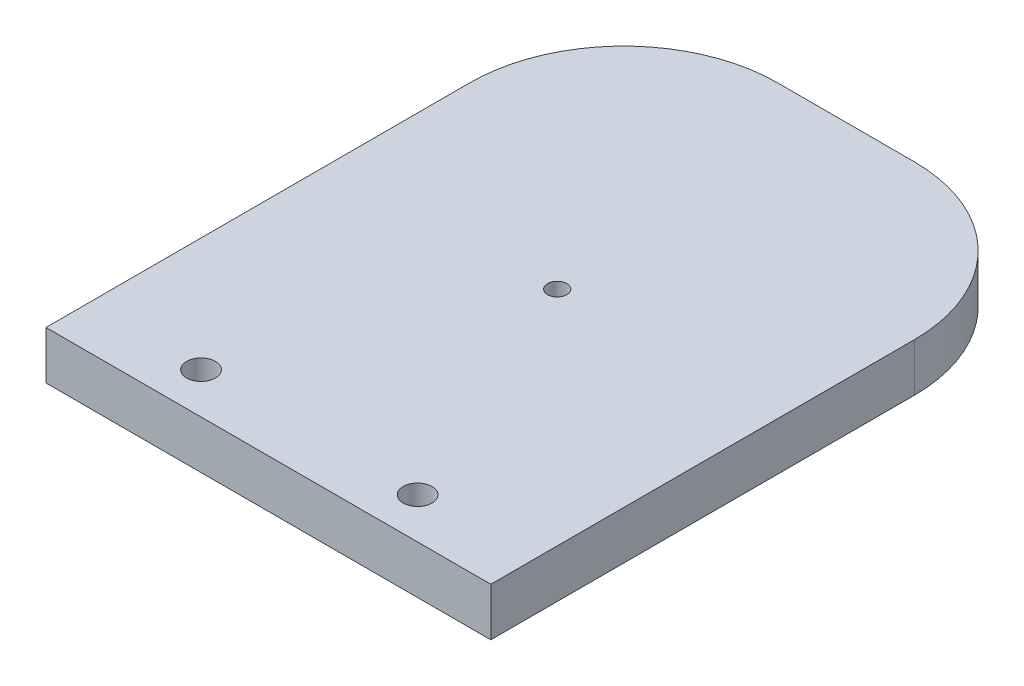
ISO-10303-21;
HEADER;
FILE_DESCRIPTION(('STEP AP214'),'2;1');
FILE_NAME('part.step','',(''),(''),'','','');
FILE_SCHEMA(('AUTOMOTIVE_DESIGN { 1 0 10303 214 1 1 1 1 }'));
ENDSEC;
DATA;
#1=APPLICATION_CONTEXT('core data for automotive mechanical design processes');
#2=APPLICATION_PROTOCOL_DEFINITION('international standard','automotive_design',2000,#1);
#3=PRODUCT_CONTEXT('',#1,'mechanical');
#4=PRODUCT('Part','Part','',(#3));
#5=PRODUCT_RELATED_PRODUCT_CATEGORY('part','',(#4));
#6=PRODUCT_DEFINITION_FORMATION('','',#4);
#7=PRODUCT_DEFINITION_CONTEXT('part definition',#1,'design');
#8=PRODUCT_DEFINITION('design','',#6,#7);
#9=PRODUCT_DEFINITION_SHAPE('','',#8);
#10=(LENGTH_UNIT() NAMED_UNIT(*) SI_UNIT(.MILLI.,.METRE.));
#11=(NAMED_UNIT(*) PLANE_ANGLE_UNIT() SI_UNIT($,.RADIAN.));
#12=(NAMED_UNIT(*) SI_UNIT($,.STERADIAN.) SOLID_ANGLE_UNIT());
#13=UNCERTAINTY_MEASURE_WITH_UNIT(LENGTH_MEASURE(1.E-05),#10,'distance_accuracy_value','');
#14=(GEOMETRIC_REPRESENTATION_CONTEXT(3) GLOBAL_UNCERTAINTY_ASSIGNED_CONTEXT((#13)) GLOBAL_UNIT_ASSIGNED_CONTEXT((#10,
#11,#12)) REPRESENTATION_CONTEXT('',''));
#15=CARTESIAN_POINT('',(0.,0.,0.));
#16=DIRECTION('',(0.,0.,1.));
#17=DIRECTION('',(1.,0.,0.));
#18=AXIS2_PLACEMENT_3D('',#15,#16,#17);
#19=CARTESIAN_POINT('',(0.,6.35,0.));
#20=DIRECTION('',(0.,1.,0.));
#21=DIRECTION('',(0.,0.,1.));
#22=AXIS2_PLACEMENT_3D('',#19,#20,#21);
#23=PLANE('',#22);
#24=CARTESIAN_POINT('',(15.0495,6.35,-5.39750000000001));
#25=DIRECTION('',(0.,1.,0.));
#26=DIRECTION('',(0.,0.,1.));
#27=AXIS2_PLACEMENT_3D('',#24,#25,#26);
#28=CIRCLE('',#27,1.89865);
#29=CARTESIAN_POINT('',(15.0495,6.35,-3.49885000000001));
#30=VERTEX_POINT('',#29);
#31=EDGE_CURVE('E200',#30,#30,#28,.T.);
#32=ORIENTED_EDGE('',*,*,#31,.F.);
#33=EDGE_LOOP('',(#32));
#34=FACE_BOUND('',#33,.T.);
#35=CARTESIAN_POINT('',(43.6245,6.35,-5.39750000000002));
#36=DIRECTION('',(0.,1.,0.));
#37=DIRECTION('',(0.,0.,1.));
#38=AXIS2_PLACEMENT_3D('',#35,#36,#37);
#39=CIRCLE('',#38,1.89865);
#40=CARTESIAN_POINT('',(43.6245,6.35,-3.49885000000002));
#41=VERTEX_POINT('',#40);
#42=EDGE_CURVE('E202',#41,#41,#39,.T.);
#43=ORIENTED_EDGE('',*,*,#42,.F.);
#44=EDGE_LOOP('',(#43));
#45=FACE_BOUND('',#44,.T.);
#46=DIRECTION('',(1.,0.,0.));
#47=VECTOR('',#46,1.);
#48=CARTESIAN_POINT('',(0.,6.35,0.));
#49=LINE('',#48,#47);
#50=CARTESIAN_POINT('',(0.,6.35,0.));
#51=VERTEX_POINT('',#50);
#52=CARTESIAN_POINT('',(58.674,6.35,0.));
#53=VERTEX_POINT('',#52);
#54=EDGE_CURVE('E87',#51,#53,#49,.T.);
#55=ORIENTED_EDGE('',*,*,#54,.T.);
#56=DIRECTION('',(0.,0.,-1.));
#57=VECTOR('',#56,1.);
#58=CARTESIAN_POINT('',(58.674,6.35,0.));
#59=LINE('',#58,#57);
#60=CARTESIAN_POINT('',(58.6739999999998,6.35,-55.8800000000001));
#61=VERTEX_POINT('',#60);
#62=EDGE_CURVE('E90',#53,#61,#59,.T.);
#63=ORIENTED_EDGE('',*,*,#62,.T.);
#64=CARTESIAN_POINT('',(38.3539999999998,6.35,-55.88));
#65=DIRECTION('',(0.,1.,0.));
#66=DIRECTION('',(0.,0.,1.));
#67=AXIS2_PLACEMENT_3D('',#64,#65,#66);
#68=CIRCLE('',#67,20.32);
#69=CARTESIAN_POINT('',(38.3539999999998,6.35,-76.2));
#70=VERTEX_POINT('',#69);
#71=EDGE_CURVE('E41',#61,#70,#68,.T.);
#72=ORIENTED_EDGE('',*,*,#71,.T.);
#73=DIRECTION('',(-1.,0.,0.));
#74=VECTOR('',#73,1.);
#75=CARTESIAN_POINT('',(-2.84714495238852E-13,6.35,-76.2));
#76=LINE('',#75,#74);
#77=CARTESIAN_POINT('',(20.3199999999998,6.35,-76.2));
#78=VERTEX_POINT('',#77);
#79=EDGE_CURVE('E106',#70,#78,#76,.T.);
#80=ORIENTED_EDGE('',*,*,#79,.T.);
#81=CARTESIAN_POINT('',(20.3199999999998,6.35,-55.88));
#82=DIRECTION('',(0.,1.,0.));
#83=DIRECTION('',(0.,0.,1.));
#84=AXIS2_PLACEMENT_3D('',#81,#82,#83);
#85=CIRCLE('',#84,20.32);
#86=CARTESIAN_POINT('',(-2.08790629841825E-13,6.35,-55.8799999999999));
#87=VERTEX_POINT('',#86);
#88=EDGE_CURVE('E48',#78,#87,#85,.T.);
#89=ORIENTED_EDGE('',*,*,#88,.T.);
#90=DIRECTION('',(0.,0.,1.));
#91=VECTOR('',#90,1.);
#92=CARTESIAN_POINT('',(0.,6.35,0.));
#93=LINE('',#92,#91);
#94=EDGE_CURVE('E92',#87,#51,#93,.T.);
#95=ORIENTED_EDGE('',*,*,#94,.T.);
#96=EDGE_LOOP('',(#55,#63,#72,#80,#89,#95));
#97=FACE_BOUND('',#96,.T.);
#98=CARTESIAN_POINT('',(29.337,6.35,-38.1));
#99=DIRECTION('',(0.,1.,0.));
#100=DIRECTION('',(0.,0.,1.));
#101=AXIS2_PLACEMENT_3D('',#98,#99,#100);
#102=CIRCLE('',#101,1.26999999999999);
#103=CARTESIAN_POINT('',(29.337,6.35,-36.83));
#104=VERTEX_POINT('',#103);
#105=EDGE_CURVE('E113',#104,#104,#102,.T.);
#106=ORIENTED_EDGE('',*,*,#105,.F.);
#107=EDGE_LOOP('',(#106));
#108=FACE_BOUND('',#107,.T.);
#109=ADVANCED_FACE('F33',(#34,#45,#97,#108),#23,.T.);
#110=CARTESIAN_POINT('',(0.,0.,0.));
#111=DIRECTION('',(0.,1.,0.));
#112=DIRECTION('',(0.,0.,1.));
#113=AXIS2_PLACEMENT_3D('',#110,#111,#112);
#114=PLANE('',#113);
#115=CARTESIAN_POINT('',(15.0495,0.,-5.39750000000001));
#116=DIRECTION('',(0.,1.,0.));
#117=DIRECTION('',(0.,0.,1.));
#118=AXIS2_PLACEMENT_3D('',#115,#116,#117);
#119=CIRCLE('',#118,1.89865);
#120=CARTESIAN_POINT('',(15.0495,0.,-3.49885000000001));
#121=VERTEX_POINT('',#120);
#122=EDGE_CURVE('E198',#121,#121,#119,.T.);
#123=ORIENTED_EDGE('',*,*,#122,.T.);
#124=EDGE_LOOP('',(#123));
#125=FACE_BOUND('',#124,.T.);
#126=CARTESIAN_POINT('',(43.6245,0.,-5.39750000000002));
#127=DIRECTION('',(0.,1.,0.));
#128=DIRECTION('',(0.,0.,1.));
#129=AXIS2_PLACEMENT_3D('',#126,#127,#128);
#130=CIRCLE('',#129,1.89865);
#131=CARTESIAN_POINT('',(43.6245,0.,-3.49885000000002));
#132=VERTEX_POINT('',#131);
#133=EDGE_CURVE('E103',#132,#132,#130,.T.);
#134=ORIENTED_EDGE('',*,*,#133,.T.);
#135=EDGE_LOOP('',(#134));
#136=FACE_BOUND('',#135,.T.);
#137=CARTESIAN_POINT('',(29.337,0.,-38.1));
#138=DIRECTION('',(0.,1.,0.));
#139=DIRECTION('',(0.,0.,1.));
#140=AXIS2_PLACEMENT_3D('',#137,#138,#139);
#141=CIRCLE('',#140,1.26999999999999);
#142=CARTESIAN_POINT('',(29.337,0.,-36.83));
#143=VERTEX_POINT('',#142);
#144=EDGE_CURVE('E120',#143,#143,#141,.T.);
#145=ORIENTED_EDGE('',*,*,#144,.T.);
#146=EDGE_LOOP('',(#145));
#147=FACE_BOUND('',#146,.T.);
#148=DIRECTION('',(0.,0.,-1.));
#149=VECTOR('',#148,1.);
#150=CARTESIAN_POINT('',(58.674,0.,0.));
#151=LINE('',#150,#149);
#152=CARTESIAN_POINT('',(58.674,0.,0.));
#153=VERTEX_POINT('',#152);
#154=CARTESIAN_POINT('',(58.6739999999998,0.,-55.8800000000001));
#155=VERTEX_POINT('',#154);
#156=EDGE_CURVE('E118',#153,#155,#151,.T.);
#157=ORIENTED_EDGE('',*,*,#156,.F.);
#158=DIRECTION('',(1.,0.,0.));
#159=VECTOR('',#158,1.);
#160=CARTESIAN_POINT('',(0.,0.,0.));
#161=LINE('',#160,#159);
#162=CARTESIAN_POINT('',(0.,0.,0.));
#163=VERTEX_POINT('',#162);
#164=EDGE_CURVE('E96',#163,#153,#161,.T.);
#165=ORIENTED_EDGE('',*,*,#164,.F.);
#166=DIRECTION('',(0.,0.,1.));
#167=VECTOR('',#166,1.);
#168=CARTESIAN_POINT('',(0.,0.,0.));
#169=LINE('',#168,#167);
#170=CARTESIAN_POINT('',(-2.08790629841825E-13,0.,-55.8799999999999));
#171=VERTEX_POINT('',#170);
#172=EDGE_CURVE('E107',#171,#163,#169,.T.);
#173=ORIENTED_EDGE('',*,*,#172,.F.);
#174=CARTESIAN_POINT('',(20.3199999999998,0.,-55.88));
#175=DIRECTION('',(0.,1.,0.));
#176=DIRECTION('',(0.,0.,1.));
#177=AXIS2_PLACEMENT_3D('',#174,#175,#176);
#178=CIRCLE('',#177,20.32);
#179=CARTESIAN_POINT('',(20.3199999999998,0.,-76.2));
#180=VERTEX_POINT('',#179);
#181=EDGE_CURVE('E127',#171,#180,#178,.F.);
#182=ORIENTED_EDGE('',*,*,#181,.T.);
#183=DIRECTION('',(-1.,0.,0.));
#184=VECTOR('',#183,1.);
#185=CARTESIAN_POINT('',(-2.84714495238852E-13,0.,-76.2));
#186=LINE('',#185,#184);
#187=CARTESIAN_POINT('',(38.3539999999998,0.,-76.2));
#188=VERTEX_POINT('',#187);
#189=EDGE_CURVE('E110',#188,#180,#186,.T.);
#190=ORIENTED_EDGE('',*,*,#189,.F.);
#191=CARTESIAN_POINT('',(38.3539999999998,0.,-55.88));
#192=DIRECTION('',(0.,1.,0.));
#193=DIRECTION('',(0.,0.,1.));
#194=AXIS2_PLACEMENT_3D('',#191,#192,#193);
#195=CIRCLE('',#194,20.32);
#196=EDGE_CURVE('E129',#188,#155,#195,.F.);
#197=ORIENTED_EDGE('',*,*,#196,.T.);
#198=EDGE_LOOP('',(#157,#165,#173,#182,#190,#197));
#199=FACE_BOUND('',#198,.T.);
#200=ADVANCED_FACE('F141',(#125,#136,#147,#199),#114,.F.);
#201=CARTESIAN_POINT('',(58.674,6.35,0.));
#202=DIRECTION('',(-1.,0.,0.));
#203=DIRECTION('',(0.,0.,1.));
#204=AXIS2_PLACEMENT_3D('',#201,#202,#203);
#205=PLANE('',#204);
#206=ORIENTED_EDGE('',*,*,#156,.T.);
#207=DIRECTION('',(0.,-1.,0.));
#208=VECTOR('',#207,1.);
#209=CARTESIAN_POINT('',(58.6739999999998,6.35,-55.8800000000001));
#210=LINE('',#209,#208);
#211=EDGE_CURVE('E56',#155,#61,#210,.F.);
#212=ORIENTED_EDGE('',*,*,#211,.T.);
#213=ORIENTED_EDGE('',*,*,#62,.F.);
#214=DIRECTION('',(0.,1.,0.));
#215=VECTOR('',#214,1.);
#216=CARTESIAN_POINT('',(58.674,0.,0.));
#217=LINE('',#216,#215);
#218=EDGE_CURVE('E97',#153,#53,#217,.T.);
#219=ORIENTED_EDGE('',*,*,#218,.F.);
#220=EDGE_LOOP('',(#206,#212,#213,#219));
#221=FACE_BOUND('',#220,.T.);
#222=ADVANCED_FACE('F105',(#221),#205,.F.);
#223=CARTESIAN_POINT('',(0.,6.35,0.));
#224=DIRECTION('',(1.,0.,0.));
#225=DIRECTION('',(0.,0.,-1.));
#226=AXIS2_PLACEMENT_3D('',#223,#224,#225);
#227=PLANE('',#226);
#228=ORIENTED_EDGE('',*,*,#94,.F.);
#229=DIRECTION('',(0.,-1.,0.));
#230=VECTOR('',#229,1.);
#231=CARTESIAN_POINT('',(-2.08790629841825E-13,6.35,-55.8799999999999));
#232=LINE('',#231,#230);
#233=EDGE_CURVE('E11',#87,#171,#232,.T.);
#234=ORIENTED_EDGE('',*,*,#233,.T.);
#235=ORIENTED_EDGE('',*,*,#172,.T.);
#236=DIRECTION('',(0.,1.,0.));
#237=VECTOR('',#236,1.);
#238=CARTESIAN_POINT('',(0.,0.,0.));
#239=LINE('',#238,#237);
#240=EDGE_CURVE('E147',#163,#51,#239,.T.);
#241=ORIENTED_EDGE('',*,*,#240,.T.);
#242=EDGE_LOOP('',(#228,#234,#235,#241));
#243=FACE_BOUND('',#242,.T.);
#244=ADVANCED_FACE('F146',(#243),#227,.F.);
#245=CARTESIAN_POINT('',(-2.84714495238852E-13,6.35,-76.2));
#246=DIRECTION('',(0.,0.,1.));
#247=DIRECTION('',(1.,0.,0.));
#248=AXIS2_PLACEMENT_3D('',#245,#246,#247);
#249=PLANE('',#248);
#250=ORIENTED_EDGE('',*,*,#79,.F.);
#251=DIRECTION('',(0.,-1.,0.));
#252=VECTOR('',#251,1.);
#253=CARTESIAN_POINT('',(38.3539999999998,6.35,-76.2));
#254=LINE('',#253,#252);
#255=EDGE_CURVE('E124',#70,#188,#254,.T.);
#256=ORIENTED_EDGE('',*,*,#255,.T.);
#257=ORIENTED_EDGE('',*,*,#189,.T.);
#258=DIRECTION('',(0.,-1.,0.));
#259=VECTOR('',#258,1.);
#260=CARTESIAN_POINT('',(20.3199999999998,6.35,-76.2));
#261=LINE('',#260,#259);
#262=EDGE_CURVE('E117',#180,#78,#261,.F.);
#263=ORIENTED_EDGE('',*,*,#262,.T.);
#264=EDGE_LOOP('',(#250,#256,#257,#263));
#265=FACE_BOUND('',#264,.T.);
#266=ADVANCED_FACE('F136',(#265),#249,.F.);
#267=CARTESIAN_POINT('',(29.337,0.,-38.1));
#268=DIRECTION('',(0.,1.,0.));
#269=DIRECTION('',(0.,0.,1.));
#270=AXIS2_PLACEMENT_3D('',#267,#268,#269);
#271=CYLINDRICAL_SURFACE('',#270,1.26999999999999);
#272=ORIENTED_EDGE('',*,*,#144,.F.);
#273=EDGE_LOOP('',(#272));
#274=FACE_BOUND('',#273,.T.);
#275=ORIENTED_EDGE('',*,*,#105,.T.);
#276=EDGE_LOOP('',(#275));
#277=FACE_BOUND('',#276,.T.);
#278=ADVANCED_FACE('F157',(#274,#277),#271,.F.);
#279=CARTESIAN_POINT('',(0.,0.,0.));
#280=DIRECTION('',(0.,0.,1.));
#281=DIRECTION('',(1.,0.,0.));
#282=AXIS2_PLACEMENT_3D('',#279,#280,#281);
#283=PLANE('',#282);
#284=ORIENTED_EDGE('',*,*,#54,.F.);
#285=ORIENTED_EDGE('',*,*,#240,.F.);
#286=ORIENTED_EDGE('',*,*,#164,.T.);
#287=ORIENTED_EDGE('',*,*,#218,.T.);
#288=EDGE_LOOP('',(#284,#285,#286,#287));
#289=FACE_BOUND('',#288,.T.);
#290=ADVANCED_FACE('F100',(#289),#283,.T.);
#291=CARTESIAN_POINT('',(38.3539999999998,6.35,-55.88));
#292=DIRECTION('',(0.,-1.,0.));
#293=DIRECTION('',(0.,0.,-1.));
#294=AXIS2_PLACEMENT_3D('',#291,#292,#293);
#295=CYLINDRICAL_SURFACE('',#294,20.32);
#296=ORIENTED_EDGE('',*,*,#71,.F.);
#297=ORIENTED_EDGE('',*,*,#211,.F.);
#298=ORIENTED_EDGE('',*,*,#196,.F.);
#299=ORIENTED_EDGE('',*,*,#255,.F.);
#300=EDGE_LOOP('',(#296,#297,#298,#299));
#301=FACE_BOUND('',#300,.T.);
#302=ADVANCED_FACE('F139',(#301),#295,.T.);
#303=CARTESIAN_POINT('',(20.3199999999998,6.35,-55.88));
#304=DIRECTION('',(0.,-1.,0.));
#305=DIRECTION('',(0.,0.,-1.));
#306=AXIS2_PLACEMENT_3D('',#303,#304,#305);
#307=CYLINDRICAL_SURFACE('',#306,20.32);
#308=ORIENTED_EDGE('',*,*,#88,.F.);
#309=ORIENTED_EDGE('',*,*,#262,.F.);
#310=ORIENTED_EDGE('',*,*,#181,.F.);
#311=ORIENTED_EDGE('',*,*,#233,.F.);
#312=EDGE_LOOP('',(#308,#309,#310,#311));
#313=FACE_BOUND('',#312,.T.);
#314=ADVANCED_FACE('F35',(#313),#307,.T.);
#315=CARTESIAN_POINT('',(43.6245,0.,-5.39750000000002));
#316=DIRECTION('',(0.,1.,0.));
#317=DIRECTION('',(0.,0.,1.));
#318=AXIS2_PLACEMENT_3D('',#315,#316,#317);
#319=CYLINDRICAL_SURFACE('',#318,1.89865);
#320=ORIENTED_EDGE('',*,*,#133,.F.);
#321=EDGE_LOOP('',(#320));
#322=FACE_BOUND('',#321,.T.);
#323=ORIENTED_EDGE('',*,*,#42,.T.);
#324=EDGE_LOOP('',(#323));
#325=FACE_BOUND('',#324,.T.);
#326=ADVANCED_FACE('F182',(#322,#325),#319,.F.);
#327=CARTESIAN_POINT('',(15.0495,0.,-5.39750000000001));
#328=DIRECTION('',(0.,1.,0.));
#329=DIRECTION('',(0.,0.,1.));
#330=AXIS2_PLACEMENT_3D('',#327,#328,#329);
#331=CYLINDRICAL_SURFACE('',#330,1.89865);
#332=ORIENTED_EDGE('',*,*,#122,.F.);
#333=EDGE_LOOP('',(#332));
#334=FACE_BOUND('',#333,.T.);
#335=ORIENTED_EDGE('',*,*,#31,.T.);
#336=EDGE_LOOP('',(#335));
#337=FACE_BOUND('',#336,.T.);
#338=ADVANCED_FACE('F189',(#334,#337),#331,.F.);
#339=CLOSED_SHELL('',(#109,#200,#222,#244,#266,#278,#290,#302,#314,#326,#338));
#340=MANIFOLD_SOLID_BREP('B2',#339);
#341=ADVANCED_BREP_SHAPE_REPRESENTATION('',(#18,#340),#14);
#342=SHAPE_DEFINITION_REPRESENTATION(#9,#341);
ENDSEC;
END-ISO-10303-21;
